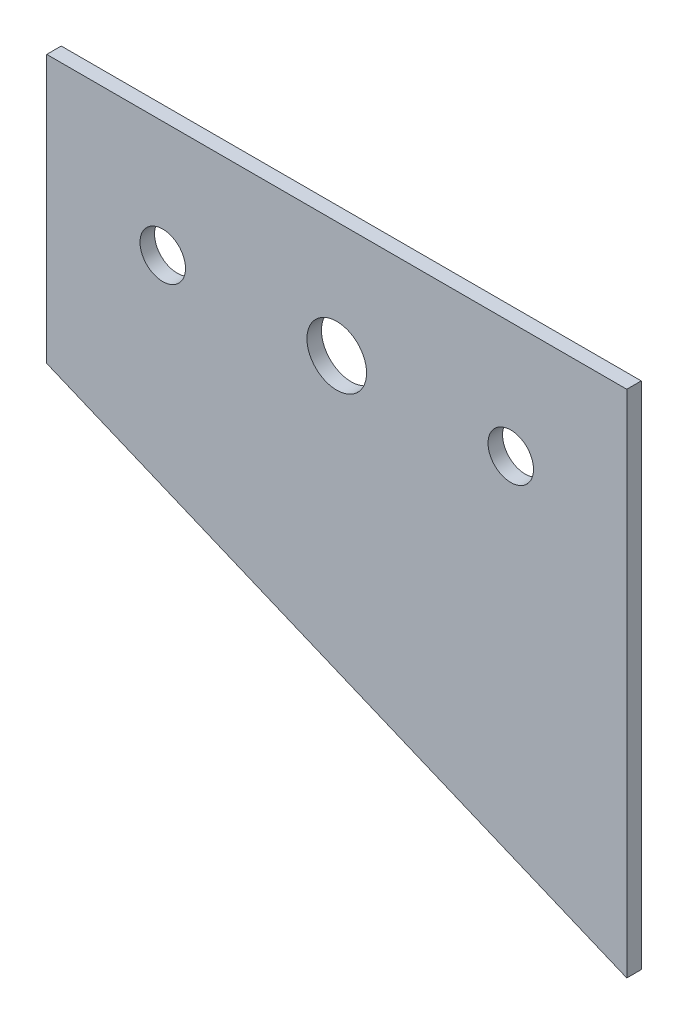
ISO-10303-21;
HEADER;
FILE_DESCRIPTION(('STEP AP214'),'2;1');
FILE_NAME('part.step','',(''),(''),'','','');
FILE_SCHEMA(('AUTOMOTIVE_DESIGN { 1 0 10303 214 1 1 1 1 }'));
ENDSEC;
DATA;
#1=APPLICATION_CONTEXT('core data for automotive mechanical design processes');
#2=APPLICATION_PROTOCOL_DEFINITION('international standard','automotive_design',2000,#1);
#3=PRODUCT_CONTEXT('',#1,'mechanical');
#4=PRODUCT('Part','Part','',(#3));
#5=PRODUCT_RELATED_PRODUCT_CATEGORY('part','',(#4));
#6=PRODUCT_DEFINITION_FORMATION('','',#4);
#7=PRODUCT_DEFINITION_CONTEXT('part definition',#1,'design');
#8=PRODUCT_DEFINITION('design','',#6,#7);
#9=PRODUCT_DEFINITION_SHAPE('','',#8);
#10=(LENGTH_UNIT() NAMED_UNIT(*) SI_UNIT(.MILLI.,.METRE.));
#11=(NAMED_UNIT(*) PLANE_ANGLE_UNIT() SI_UNIT($,.RADIAN.));
#12=(NAMED_UNIT(*) SI_UNIT($,.STERADIAN.) SOLID_ANGLE_UNIT());
#13=UNCERTAINTY_MEASURE_WITH_UNIT(LENGTH_MEASURE(1.E-05),#10,'distance_accuracy_value','');
#14=(GEOMETRIC_REPRESENTATION_CONTEXT(3) GLOBAL_UNCERTAINTY_ASSIGNED_CONTEXT((#13)) GLOBAL_UNIT_ASSIGNED_CONTEXT((#10,
#11,#12)) REPRESENTATION_CONTEXT('',''));
#15=CARTESIAN_POINT('',(0.,0.,0.));
#16=DIRECTION('',(0.,0.,1.));
#17=DIRECTION('',(1.,0.,0.));
#18=AXIS2_PLACEMENT_3D('',#15,#16,#17);
#19=CARTESIAN_POINT('',(1397.7304433415,0.,1.5875));
#20=DIRECTION('',(1.,0.,0.));
#21=DIRECTION('',(0.,0.,-1.));
#22=AXIS2_PLACEMENT_3D('',#19,#20,#21);
#23=PLANE('',#22);
#24=DIRECTION('',(0.,-1.,0.));
#25=VECTOR('',#24,1.);
#26=CARTESIAN_POINT('',(1397.7304433415,0.,0.));
#27=LINE('',#26,#25);
#28=CARTESIAN_POINT('',(1397.7304433415,-278.791209664265,0.));
#29=VERTEX_POINT('',#28);
#30=CARTESIAN_POINT('',(1397.7304433415,-308.095189664265,0.));
#31=VERTEX_POINT('',#30);
#32=EDGE_CURVE('E118',#29,#31,#27,.T.);
#33=ORIENTED_EDGE('',*,*,#32,.T.);
#34=DIRECTION('',(0.,0.,-1.));
#35=VECTOR('',#34,1.);
#36=CARTESIAN_POINT('',(1397.7304433415,-308.095189664265,1.5875));
#37=LINE('',#36,#35);
#38=CARTESIAN_POINT('',(1397.7304433415,-308.095189664265,1.5875));
#39=VERTEX_POINT('',#38);
#40=EDGE_CURVE('E11',#39,#31,#37,.T.);
#41=ORIENTED_EDGE('',*,*,#40,.F.);
#42=DIRECTION('',(0.,-1.,0.));
#43=VECTOR('',#42,1.);
#44=CARTESIAN_POINT('',(1397.7304433415,0.,1.5875));
#45=LINE('',#44,#43);
#46=CARTESIAN_POINT('',(1397.7304433415,-278.791209664265,1.5875));
#47=VERTEX_POINT('',#46);
#48=EDGE_CURVE('E97',#47,#39,#45,.T.);
#49=ORIENTED_EDGE('',*,*,#48,.F.);
#50=DIRECTION('',(0.,0.,-1.));
#51=VECTOR('',#50,1.);
#52=CARTESIAN_POINT('',(1397.7304433415,-278.791209664265,1.5875));
#53=LINE('',#52,#51);
#54=EDGE_CURVE('E105',#47,#29,#53,.T.);
#55=ORIENTED_EDGE('',*,*,#54,.T.);
#56=EDGE_LOOP('',(#33,#41,#49,#55));
#57=FACE_BOUND('',#56,.T.);
#58=ADVANCED_FACE('F45',(#57),#23,.F.);
#59=CARTESIAN_POINT('',(97.9841723031021,234.649233101034,1.5875));
#60=DIRECTION('',(0.38533120499207,0.922778338746288,0.));
#61=DIRECTION('',(-0.922778338746288,0.38533120499207,0.));
#62=AXIS2_PLACEMENT_3D('',#59,#60,#61);
#63=PLANE('',#62);
#64=DIRECTION('',(0.922778338746288,-0.38533120499207,0.));
#65=VECTOR('',#64,1.);
#66=CARTESIAN_POINT('',(97.9841723031021,234.649233101034,0.));
#67=LINE('',#66,#65);
#68=CARTESIAN_POINT('',(1461.2304433415,-334.611342557754,0.));
#69=VERTEX_POINT('',#68);
#70=EDGE_CURVE('E101',#31,#69,#67,.T.);
#71=ORIENTED_EDGE('',*,*,#70,.T.);
#72=DIRECTION('',(0.,0.,-1.));
#73=VECTOR('',#72,1.);
#74=CARTESIAN_POINT('',(1461.2304433415,-334.611342557754,1.5875));
#75=LINE('',#74,#73);
#76=CARTESIAN_POINT('',(1461.2304433415,-334.611342557754,1.5875));
#77=VERTEX_POINT('',#76);
#78=EDGE_CURVE('E54',#77,#69,#75,.T.);
#79=ORIENTED_EDGE('',*,*,#78,.F.);
#80=DIRECTION('',(0.922778338746288,-0.38533120499207,0.));
#81=VECTOR('',#80,1.);
#82=CARTESIAN_POINT('',(97.9841723031021,234.649233101034,1.5875));
#83=LINE('',#82,#81);
#84=EDGE_CURVE('E92',#39,#77,#83,.T.);
#85=ORIENTED_EDGE('',*,*,#84,.F.);
#86=ORIENTED_EDGE('',*,*,#40,.T.);
#87=EDGE_LOOP('',(#71,#79,#85,#86));
#88=FACE_BOUND('',#87,.T.);
#89=ADVANCED_FACE('F100',(#88),#63,.F.);
#90=CARTESIAN_POINT('',(1461.2304433415,0.,1.5875));
#91=DIRECTION('',(-1.,0.,0.));
#92=DIRECTION('',(0.,0.,1.));
#93=AXIS2_PLACEMENT_3D('',#90,#91,#92);
#94=PLANE('',#93);
#95=DIRECTION('',(0.,1.,0.));
#96=VECTOR('',#95,1.);
#97=CARTESIAN_POINT('',(1461.2304433415,0.,0.));
#98=LINE('',#97,#96);
#99=CARTESIAN_POINT('',(1461.2304433415,-278.791209664265,0.));
#100=VERTEX_POINT('',#99);
#101=EDGE_CURVE('E79',#69,#100,#98,.T.);
#102=ORIENTED_EDGE('',*,*,#101,.T.);
#103=DIRECTION('',(0.,0.,-1.));
#104=VECTOR('',#103,1.);
#105=CARTESIAN_POINT('',(1461.2304433415,-278.791209664265,1.5875));
#106=LINE('',#105,#104);
#107=CARTESIAN_POINT('',(1461.2304433415,-278.791209664265,1.5875));
#108=VERTEX_POINT('',#107);
#109=EDGE_CURVE('E102',#108,#100,#106,.T.);
#110=ORIENTED_EDGE('',*,*,#109,.F.);
#111=DIRECTION('',(0.,1.,0.));
#112=VECTOR('',#111,1.);
#113=CARTESIAN_POINT('',(1461.2304433415,0.,1.5875));
#114=LINE('',#113,#112);
#115=EDGE_CURVE('E95',#77,#108,#114,.T.);
#116=ORIENTED_EDGE('',*,*,#115,.F.);
#117=ORIENTED_EDGE('',*,*,#78,.T.);
#118=EDGE_LOOP('',(#102,#110,#116,#117));
#119=FACE_BOUND('',#118,.T.);
#120=ADVANCED_FACE('F103',(#119),#94,.F.);
#121=CARTESIAN_POINT('',(1410.4304433415,-291.492960492317,1.5875));
#122=DIRECTION('',(0.,0.,-1.));
#123=DIRECTION('',(-1.,0.,0.));
#124=AXIS2_PLACEMENT_3D('',#121,#122,#123);
#125=CYLINDRICAL_SURFACE('',#124,2.48920000000017);
#126=CARTESIAN_POINT('',(1410.4304433415,-291.492960492317,1.5875));
#127=DIRECTION('',(0.,0.,1.));
#128=DIRECTION('',(1.,0.,0.));
#129=AXIS2_PLACEMENT_3D('',#126,#127,#128);
#130=CIRCLE('',#129,2.48920000000017);
#131=CARTESIAN_POINT('',(1412.9196433415,-291.492960492317,1.5875));
#132=VERTEX_POINT('',#131);
#133=EDGE_CURVE('E131',#132,#132,#130,.T.);
#134=ORIENTED_EDGE('',*,*,#133,.T.);
#135=EDGE_LOOP('',(#134));
#136=FACE_BOUND('',#135,.T.);
#137=CARTESIAN_POINT('',(1410.4304433415,-291.492960492317,0.));
#138=DIRECTION('',(0.,0.,1.));
#139=DIRECTION('',(1.,0.,0.));
#140=AXIS2_PLACEMENT_3D('',#137,#138,#139);
#141=CIRCLE('',#140,2.48920000000017);
#142=CARTESIAN_POINT('',(1412.9196433415,-291.492960492317,0.));
#143=VERTEX_POINT('',#142);
#144=EDGE_CURVE('E115',#143,#143,#141,.T.);
#145=ORIENTED_EDGE('',*,*,#144,.F.);
#146=EDGE_LOOP('',(#145));
#147=FACE_BOUND('',#146,.T.);
#148=ADVANCED_FACE('F150',(#136,#147),#125,.F.);
#149=CARTESIAN_POINT('',(1448.5304433415,-291.492960492317,1.5875));
#150=DIRECTION('',(0.,0.,-1.));
#151=DIRECTION('',(-1.,0.,0.));
#152=AXIS2_PLACEMENT_3D('',#149,#150,#151);
#153=CYLINDRICAL_SURFACE('',#152,2.48920000000017);
#154=CARTESIAN_POINT('',(1448.5304433415,-291.492960492317,1.5875));
#155=DIRECTION('',(0.,0.,1.));
#156=DIRECTION('',(1.,0.,0.));
#157=AXIS2_PLACEMENT_3D('',#154,#155,#156);
#158=CIRCLE('',#157,2.48920000000017);
#159=CARTESIAN_POINT('',(1451.0196433415,-291.492960492317,1.5875));
#160=VERTEX_POINT('',#159);
#161=EDGE_CURVE('E133',#160,#160,#158,.T.);
#162=ORIENTED_EDGE('',*,*,#161,.T.);
#163=EDGE_LOOP('',(#162));
#164=FACE_BOUND('',#163,.T.);
#165=CARTESIAN_POINT('',(1448.5304433415,-291.492960492317,0.));
#166=DIRECTION('',(0.,0.,1.));
#167=DIRECTION('',(1.,0.,0.));
#168=AXIS2_PLACEMENT_3D('',#165,#166,#167);
#169=CIRCLE('',#168,2.48920000000017);
#170=CARTESIAN_POINT('',(1451.0196433415,-291.492960492317,0.));
#171=VERTEX_POINT('',#170);
#172=EDGE_CURVE('E112',#171,#171,#169,.T.);
#173=ORIENTED_EDGE('',*,*,#172,.F.);
#174=EDGE_LOOP('',(#173));
#175=FACE_BOUND('',#174,.T.);
#176=ADVANCED_FACE('F153',(#164,#175),#153,.F.);
#177=CARTESIAN_POINT('',(1429.4804433415,-291.492960492317,1.5875));
#178=DIRECTION('',(0.,0.,-1.));
#179=DIRECTION('',(-1.,0.,0.));
#180=AXIS2_PLACEMENT_3D('',#177,#178,#179);
#181=CYLINDRICAL_SURFACE('',#180,3.26390000000012);
#182=CARTESIAN_POINT('',(1429.4804433415,-291.492960492317,1.5875));
#183=DIRECTION('',(0.,0.,1.));
#184=DIRECTION('',(1.,0.,0.));
#185=AXIS2_PLACEMENT_3D('',#182,#183,#184);
#186=CIRCLE('',#185,3.26390000000012);
#187=CARTESIAN_POINT('',(1432.7443433415,-291.492960492317,1.5875));
#188=VERTEX_POINT('',#187);
#189=EDGE_CURVE('E124',#188,#188,#186,.T.);
#190=ORIENTED_EDGE('',*,*,#189,.T.);
#191=EDGE_LOOP('',(#190));
#192=FACE_BOUND('',#191,.T.);
#193=CARTESIAN_POINT('',(1429.4804433415,-291.492960492317,0.));
#194=DIRECTION('',(0.,0.,1.));
#195=DIRECTION('',(1.,0.,0.));
#196=AXIS2_PLACEMENT_3D('',#193,#194,#195);
#197=CIRCLE('',#196,3.26390000000012);
#198=CARTESIAN_POINT('',(1432.7443433415,-291.492960492317,0.));
#199=VERTEX_POINT('',#198);
#200=EDGE_CURVE('E109',#199,#199,#197,.T.);
#201=ORIENTED_EDGE('',*,*,#200,.F.);
#202=EDGE_LOOP('',(#201));
#203=FACE_BOUND('',#202,.T.);
#204=ADVANCED_FACE('F47',(#192,#203),#181,.F.);
#205=CARTESIAN_POINT('',(0.,-278.791209664265,1.5875));
#206=DIRECTION('',(0.,-1.,0.));
#207=DIRECTION('',(0.,0.,-1.));
#208=AXIS2_PLACEMENT_3D('',#205,#206,#207);
#209=PLANE('',#208);
#210=DIRECTION('',(-1.,0.,0.));
#211=VECTOR('',#210,1.);
#212=CARTESIAN_POINT('',(0.,-278.791209664265,0.));
#213=LINE('',#212,#211);
#214=EDGE_CURVE('E85',#100,#29,#213,.T.);
#215=ORIENTED_EDGE('',*,*,#214,.T.);
#216=ORIENTED_EDGE('',*,*,#54,.F.);
#217=DIRECTION('',(-1.,0.,0.));
#218=VECTOR('',#217,1.);
#219=CARTESIAN_POINT('',(0.,-278.791209664265,1.5875));
#220=LINE('',#219,#218);
#221=EDGE_CURVE('E62',#108,#47,#220,.T.);
#222=ORIENTED_EDGE('',*,*,#221,.F.);
#223=ORIENTED_EDGE('',*,*,#109,.T.);
#224=EDGE_LOOP('',(#215,#216,#222,#223));
#225=FACE_BOUND('',#224,.T.);
#226=ADVANCED_FACE('F126',(#225),#209,.F.);
#227=CARTESIAN_POINT('',(0.,0.,1.5875));
#228=DIRECTION('',(0.,0.,1.));
#229=DIRECTION('',(1.,0.,0.));
#230=AXIS2_PLACEMENT_3D('',#227,#228,#229);
#231=PLANE('',#230);
#232=ORIENTED_EDGE('',*,*,#189,.F.);
#233=EDGE_LOOP('',(#232));
#234=FACE_BOUND('',#233,.T.);
#235=ORIENTED_EDGE('',*,*,#161,.F.);
#236=EDGE_LOOP('',(#235));
#237=FACE_BOUND('',#236,.T.);
#238=ORIENTED_EDGE('',*,*,#133,.F.);
#239=EDGE_LOOP('',(#238));
#240=FACE_BOUND('',#239,.T.);
#241=ORIENTED_EDGE('',*,*,#48,.T.);
#242=ORIENTED_EDGE('',*,*,#84,.T.);
#243=ORIENTED_EDGE('',*,*,#115,.T.);
#244=ORIENTED_EDGE('',*,*,#221,.T.);
#245=EDGE_LOOP('',(#241,#242,#243,#244));
#246=FACE_BOUND('',#245,.T.);
#247=ADVANCED_FACE('F93',(#234,#237,#240,#246),#231,.T.);
#248=CARTESIAN_POINT('',(0.,0.,0.));
#249=DIRECTION('',(0.,0.,1.));
#250=DIRECTION('',(1.,0.,0.));
#251=AXIS2_PLACEMENT_3D('',#248,#249,#250);
#252=PLANE('',#251);
#253=ORIENTED_EDGE('',*,*,#200,.T.);
#254=EDGE_LOOP('',(#253));
#255=FACE_BOUND('',#254,.T.);
#256=ORIENTED_EDGE('',*,*,#172,.T.);
#257=EDGE_LOOP('',(#256));
#258=FACE_BOUND('',#257,.T.);
#259=ORIENTED_EDGE('',*,*,#144,.T.);
#260=EDGE_LOOP('',(#259));
#261=FACE_BOUND('',#260,.T.);
#262=ORIENTED_EDGE('',*,*,#32,.F.);
#263=ORIENTED_EDGE('',*,*,#214,.F.);
#264=ORIENTED_EDGE('',*,*,#101,.F.);
#265=ORIENTED_EDGE('',*,*,#70,.F.);
#266=EDGE_LOOP('',(#262,#263,#264,#265));
#267=FACE_BOUND('',#266,.T.);
#268=ADVANCED_FACE('F129',(#255,#258,#261,#267),#252,.F.);
#269=CLOSED_SHELL('',(#58,#89,#120,#148,#176,#204,#226,#247,#268));
#270=MANIFOLD_SOLID_BREP('B2',#269);
#271=ADVANCED_BREP_SHAPE_REPRESENTATION('',(#18,#270),#14);
#272=SHAPE_DEFINITION_REPRESENTATION(#9,#271);
ENDSEC;
END-ISO-10303-21;
